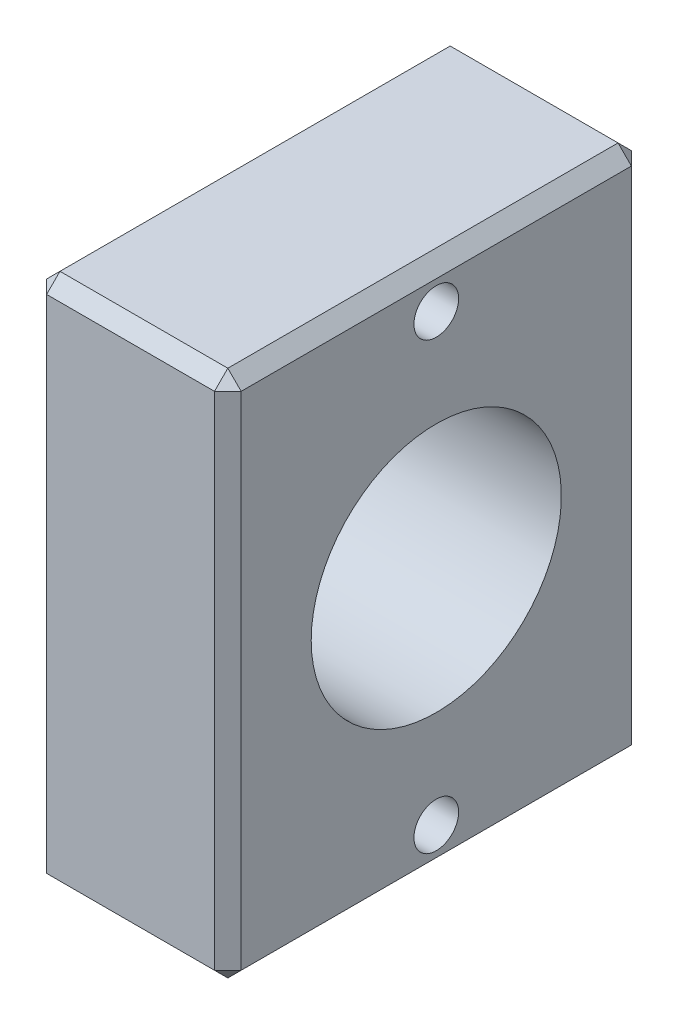
ISO-10303-21;
HEADER;
FILE_DESCRIPTION(('STEP AP214'),'2;1');
FILE_NAME('part.step','',(''),(''),'','','');
FILE_SCHEMA(('AUTOMOTIVE_DESIGN { 1 0 10303 214 1 1 1 1 }'));
ENDSEC;
DATA;
#1=APPLICATION_CONTEXT('core data for automotive mechanical design processes');
#2=APPLICATION_PROTOCOL_DEFINITION('international standard','automotive_design',2000,#1);
#3=PRODUCT_CONTEXT('',#1,'mechanical');
#4=PRODUCT('Part','Part','',(#3));
#5=PRODUCT_RELATED_PRODUCT_CATEGORY('part','',(#4));
#6=PRODUCT_DEFINITION_FORMATION('','',#4);
#7=PRODUCT_DEFINITION_CONTEXT('part definition',#1,'design');
#8=PRODUCT_DEFINITION('design','',#6,#7);
#9=PRODUCT_DEFINITION_SHAPE('','',#8);
#10=(LENGTH_UNIT() NAMED_UNIT(*) SI_UNIT(.MILLI.,.METRE.));
#11=(NAMED_UNIT(*) PLANE_ANGLE_UNIT() SI_UNIT($,.RADIAN.));
#12=(NAMED_UNIT(*) SI_UNIT($,.STERADIAN.) SOLID_ANGLE_UNIT());
#13=UNCERTAINTY_MEASURE_WITH_UNIT(LENGTH_MEASURE(1.E-05),#10,'distance_accuracy_value','');
#14=(GEOMETRIC_REPRESENTATION_CONTEXT(3) GLOBAL_UNCERTAINTY_ASSIGNED_CONTEXT((#13)) GLOBAL_UNIT_ASSIGNED_CONTEXT((#10,
#11,#12)) REPRESENTATION_CONTEXT('',''));
#15=CARTESIAN_POINT('',(0.,0.,0.));
#16=DIRECTION('',(0.,0.,1.));
#17=DIRECTION('',(1.,0.,0.));
#18=AXIS2_PLACEMENT_3D('',#15,#16,#17);
#19=CARTESIAN_POINT('',(-11.1125,30.1625,23.8125));
#20=DIRECTION('',(1.,0.,0.));
#21=DIRECTION('',(0.,0.,-1.));
#22=AXIS2_PLACEMENT_3D('',#19,#20,#21);
#23=PLANE('',#22);
#24=DIRECTION('',(0.,-1.,0.));
#25=VECTOR('',#24,1.);
#26=CARTESIAN_POINT('',(-11.1125,30.1625,-22.2885));
#27=LINE('',#26,#25);
#28=CARTESIAN_POINT('',(-11.1125,28.6385,-22.2885));
#29=VERTEX_POINT('',#28);
#30=CARTESIAN_POINT('',(-11.1125,-28.6385,-22.2885));
#31=VERTEX_POINT('',#30);
#32=EDGE_CURVE('E189',#29,#31,#27,.T.);
#33=ORIENTED_EDGE('',*,*,#32,.T.);
#34=DIRECTION('',(0.,0.,1.));
#35=VECTOR('',#34,1.);
#36=CARTESIAN_POINT('',(-11.1125,-28.6385,23.8125));
#37=LINE('',#36,#35);
#38=CARTESIAN_POINT('',(-11.1125,-28.6385,22.2885));
#39=VERTEX_POINT('',#38);
#40=EDGE_CURVE('E191',#31,#39,#37,.T.);
#41=ORIENTED_EDGE('',*,*,#40,.T.);
#42=DIRECTION('',(0.,1.,0.));
#43=VECTOR('',#42,1.);
#44=CARTESIAN_POINT('',(-11.1125,30.1625,22.2885));
#45=LINE('',#44,#43);
#46=CARTESIAN_POINT('',(-11.1125,28.6385,22.2885));
#47=VERTEX_POINT('',#46);
#48=EDGE_CURVE('E185',#39,#47,#45,.T.);
#49=ORIENTED_EDGE('',*,*,#48,.T.);
#50=DIRECTION('',(0.,0.,-1.));
#51=VECTOR('',#50,1.);
#52=CARTESIAN_POINT('',(-11.1125,28.6385,-23.8125));
#53=LINE('',#52,#51);
#54=EDGE_CURVE('E187',#47,#29,#53,.T.);
#55=ORIENTED_EDGE('',*,*,#54,.T.);
#56=EDGE_LOOP('',(#33,#41,#49,#55));
#57=FACE_BOUND('',#56,.T.);
#58=CARTESIAN_POINT('',(-11.1125,-25.4,0.));
#59=DIRECTION('',(-1.,0.,0.));
#60=DIRECTION('',(0.,0.,1.));
#61=AXIS2_PLACEMENT_3D('',#58,#59,#60);
#62=CIRCLE('',#61,2.5527);
#63=CARTESIAN_POINT('',(-11.1125,-25.4,2.5527));
#64=VERTEX_POINT('',#63);
#65=EDGE_CURVE('E274',#64,#64,#62,.T.);
#66=ORIENTED_EDGE('',*,*,#65,.F.);
#67=EDGE_LOOP('',(#66));
#68=FACE_BOUND('',#67,.T.);
#69=CARTESIAN_POINT('',(-11.1125,25.4,0.));
#70=DIRECTION('',(-1.,0.,0.));
#71=DIRECTION('',(0.,0.,1.));
#72=AXIS2_PLACEMENT_3D('',#69,#70,#71);
#73=CIRCLE('',#72,2.5527);
#74=CARTESIAN_POINT('',(-11.1125,25.4,2.5527));
#75=VERTEX_POINT('',#74);
#76=EDGE_CURVE('E283',#75,#75,#73,.T.);
#77=ORIENTED_EDGE('',*,*,#76,.F.);
#78=EDGE_LOOP('',(#77));
#79=FACE_BOUND('',#78,.T.);
#80=CARTESIAN_POINT('',(-11.1125,0.,0.));
#81=DIRECTION('',(-1.,0.,0.));
#82=DIRECTION('',(0.,0.,1.));
#83=AXIS2_PLACEMENT_3D('',#80,#81,#82);
#84=CIRCLE('',#83,14.2875);
#85=CARTESIAN_POINT('',(-11.1125,0.,14.2875));
#86=VERTEX_POINT('',#85);
#87=EDGE_CURVE('E169',#86,#86,#84,.T.);
#88=ORIENTED_EDGE('',*,*,#87,.F.);
#89=EDGE_LOOP('',(#88));
#90=FACE_BOUND('',#89,.T.);
#91=ADVANCED_FACE('F41',(#57,#68,#79,#90),#23,.F.);
#92=CARTESIAN_POINT('',(11.1125,30.1625,23.8125));
#93=DIRECTION('',(0.,0.,-1.));
#94=DIRECTION('',(-1.,0.,0.));
#95=AXIS2_PLACEMENT_3D('',#92,#93,#94);
#96=PLANE('',#95);
#97=DIRECTION('',(-1.,0.,0.));
#98=VECTOR('',#97,1.);
#99=CARTESIAN_POINT('',(-11.1125,28.6385,23.8125));
#100=LINE('',#99,#98);
#101=CARTESIAN_POINT('',(9.5885,28.6385,23.8125));
#102=VERTEX_POINT('',#101);
#103=CARTESIAN_POINT('',(-9.58850000000001,28.6385,23.8125));
#104=VERTEX_POINT('',#103);
#105=EDGE_CURVE('E51',#102,#104,#100,.T.);
#106=ORIENTED_EDGE('',*,*,#105,.T.);
#107=DIRECTION('',(0.,-1.,0.));
#108=VECTOR('',#107,1.);
#109=CARTESIAN_POINT('',(-9.58850000000001,30.1625,23.8125));
#110=LINE('',#109,#108);
#111=CARTESIAN_POINT('',(-9.58850000000001,-28.6385,23.8125));
#112=VERTEX_POINT('',#111);
#113=EDGE_CURVE('E11',#104,#112,#110,.T.);
#114=ORIENTED_EDGE('',*,*,#113,.T.);
#115=DIRECTION('',(1.,0.,0.));
#116=VECTOR('',#115,1.);
#117=CARTESIAN_POINT('',(11.1125,-28.6385,23.8125));
#118=LINE('',#117,#116);
#119=CARTESIAN_POINT('',(9.5885,-28.6385,23.8125));
#120=VERTEX_POINT('',#119);
#121=EDGE_CURVE('E211',#112,#120,#118,.T.);
#122=ORIENTED_EDGE('',*,*,#121,.T.);
#123=DIRECTION('',(0.,1.,0.));
#124=VECTOR('',#123,1.);
#125=CARTESIAN_POINT('',(9.5885,30.1625,23.8125));
#126=LINE('',#125,#124);
#127=EDGE_CURVE('E62',#120,#102,#126,.T.);
#128=ORIENTED_EDGE('',*,*,#127,.T.);
#129=EDGE_LOOP('',(#106,#114,#122,#128));
#130=FACE_BOUND('',#129,.T.);
#131=ADVANCED_FACE('F293',(#130),#96,.F.);
#132=CARTESIAN_POINT('',(11.1125,30.1625,23.8125));
#133=DIRECTION('',(-1.,0.,0.));
#134=DIRECTION('',(0.,0.,1.));
#135=AXIS2_PLACEMENT_3D('',#132,#133,#134);
#136=PLANE('',#135);
#137=DIRECTION('',(0.,-1.,0.));
#138=VECTOR('',#137,1.);
#139=CARTESIAN_POINT('',(11.1125,30.1625,22.2885));
#140=LINE('',#139,#138);
#141=CARTESIAN_POINT('',(11.1125,28.6385,22.2885));
#142=VERTEX_POINT('',#141);
#143=CARTESIAN_POINT('',(11.1125,-28.6385,22.2885));
#144=VERTEX_POINT('',#143);
#145=EDGE_CURVE('E135',#142,#144,#140,.T.);
#146=ORIENTED_EDGE('',*,*,#145,.T.);
#147=DIRECTION('',(0.,0.,-1.));
#148=VECTOR('',#147,1.);
#149=CARTESIAN_POINT('',(11.1125,-28.6385,23.8125));
#150=LINE('',#149,#148);
#151=CARTESIAN_POINT('',(11.1125,-28.6385,-22.2885));
#152=VERTEX_POINT('',#151);
#153=EDGE_CURVE('E174',#144,#152,#150,.T.);
#154=ORIENTED_EDGE('',*,*,#153,.T.);
#155=DIRECTION('',(0.,1.,0.));
#156=VECTOR('',#155,1.);
#157=CARTESIAN_POINT('',(11.1125,30.1625,-22.2885));
#158=LINE('',#157,#156);
#159=CARTESIAN_POINT('',(11.1125,28.6385,-22.2885));
#160=VERTEX_POINT('',#159);
#161=EDGE_CURVE('E138',#152,#160,#158,.T.);
#162=ORIENTED_EDGE('',*,*,#161,.T.);
#163=DIRECTION('',(0.,0.,1.));
#164=VECTOR('',#163,1.);
#165=CARTESIAN_POINT('',(11.1125,28.6385,23.8125));
#166=LINE('',#165,#164);
#167=EDGE_CURVE('E129',#160,#142,#166,.T.);
#168=ORIENTED_EDGE('',*,*,#167,.T.);
#169=EDGE_LOOP('',(#146,#154,#162,#168));
#170=FACE_BOUND('',#169,.T.);
#171=CARTESIAN_POINT('',(11.1125,-25.4,0.));
#172=DIRECTION('',(-1.,0.,0.));
#173=DIRECTION('',(0.,0.,1.));
#174=AXIS2_PLACEMENT_3D('',#171,#172,#173);
#175=CIRCLE('',#174,2.5527);
#176=CARTESIAN_POINT('',(11.1125,-25.4,2.5527));
#177=VERTEX_POINT('',#176);
#178=EDGE_CURVE('E268',#177,#177,#175,.T.);
#179=ORIENTED_EDGE('',*,*,#178,.T.);
#180=EDGE_LOOP('',(#179));
#181=FACE_BOUND('',#180,.T.);
#182=CARTESIAN_POINT('',(11.1125,25.4,0.));
#183=DIRECTION('',(-1.,0.,0.));
#184=DIRECTION('',(0.,0.,1.));
#185=AXIS2_PLACEMENT_3D('',#182,#183,#184);
#186=CIRCLE('',#185,2.5527);
#187=CARTESIAN_POINT('',(11.1125,25.4,2.5527));
#188=VERTEX_POINT('',#187);
#189=EDGE_CURVE('E278',#188,#188,#186,.T.);
#190=ORIENTED_EDGE('',*,*,#189,.T.);
#191=EDGE_LOOP('',(#190));
#192=FACE_BOUND('',#191,.T.);
#193=CARTESIAN_POINT('',(11.1125,0.,0.));
#194=DIRECTION('',(-1.,0.,0.));
#195=DIRECTION('',(0.,0.,1.));
#196=AXIS2_PLACEMENT_3D('',#193,#194,#195);
#197=CIRCLE('',#196,14.2875);
#198=CARTESIAN_POINT('',(11.1125,0.,14.2875));
#199=VERTEX_POINT('',#198);
#200=EDGE_CURVE('E166',#199,#199,#197,.T.);
#201=ORIENTED_EDGE('',*,*,#200,.T.);
#202=EDGE_LOOP('',(#201));
#203=FACE_BOUND('',#202,.T.);
#204=ADVANCED_FACE('F131',(#170,#181,#192,#203),#136,.F.);
#205=CARTESIAN_POINT('',(11.1125,30.1625,-23.8125));
#206=DIRECTION('',(0.,0.,1.));
#207=DIRECTION('',(1.,0.,0.));
#208=AXIS2_PLACEMENT_3D('',#205,#206,#207);
#209=PLANE('',#208);
#210=DIRECTION('',(1.,0.,0.));
#211=VECTOR('',#210,1.);
#212=CARTESIAN_POINT('',(11.1125,28.6385,-23.8125));
#213=LINE('',#212,#211);
#214=CARTESIAN_POINT('',(-9.5885,28.6385,-23.8125));
#215=VERTEX_POINT('',#214);
#216=CARTESIAN_POINT('',(9.5885,28.6385,-23.8125));
#217=VERTEX_POINT('',#216);
#218=EDGE_CURVE('E194',#215,#217,#213,.T.);
#219=ORIENTED_EDGE('',*,*,#218,.T.);
#220=DIRECTION('',(0.,-1.,0.));
#221=VECTOR('',#220,1.);
#222=CARTESIAN_POINT('',(9.5885,30.1625,-23.8125));
#223=LINE('',#222,#221);
#224=CARTESIAN_POINT('',(9.5885,-28.6385,-23.8125));
#225=VERTEX_POINT('',#224);
#226=EDGE_CURVE('E200',#217,#225,#223,.T.);
#227=ORIENTED_EDGE('',*,*,#226,.T.);
#228=DIRECTION('',(-1.,0.,0.));
#229=VECTOR('',#228,1.);
#230=CARTESIAN_POINT('',(11.1125,-28.6385,-23.8125));
#231=LINE('',#230,#229);
#232=CARTESIAN_POINT('',(-9.5885,-28.6385,-23.8125));
#233=VERTEX_POINT('',#232);
#234=EDGE_CURVE('E198',#225,#233,#231,.T.);
#235=ORIENTED_EDGE('',*,*,#234,.T.);
#236=DIRECTION('',(0.,1.,0.));
#237=VECTOR('',#236,1.);
#238=CARTESIAN_POINT('',(-9.5885,30.1625,-23.8125));
#239=LINE('',#238,#237);
#240=EDGE_CURVE('E196',#233,#215,#239,.T.);
#241=ORIENTED_EDGE('',*,*,#240,.T.);
#242=EDGE_LOOP('',(#219,#227,#235,#241));
#243=FACE_BOUND('',#242,.T.);
#244=ADVANCED_FACE('F465',(#243),#209,.F.);
#245=CARTESIAN_POINT('',(0.,30.1625,0.));
#246=DIRECTION('',(0.,1.,0.));
#247=DIRECTION('',(0.,0.,1.));
#248=AXIS2_PLACEMENT_3D('',#245,#246,#247);
#249=PLANE('',#248);
#250=DIRECTION('',(0.,0.,-1.));
#251=VECTOR('',#250,1.);
#252=CARTESIAN_POINT('',(9.5885,30.1625,-23.8125));
#253=LINE('',#252,#251);
#254=CARTESIAN_POINT('',(9.5885,30.1625,22.2885));
#255=VERTEX_POINT('',#254);
#256=CARTESIAN_POINT('',(9.5885,30.1625,-22.2885));
#257=VERTEX_POINT('',#256);
#258=EDGE_CURVE('E148',#255,#257,#253,.T.);
#259=ORIENTED_EDGE('',*,*,#258,.T.);
#260=DIRECTION('',(-1.,0.,0.));
#261=VECTOR('',#260,1.);
#262=CARTESIAN_POINT('',(-11.1125,30.1625,-22.2885));
#263=LINE('',#262,#261);
#264=CARTESIAN_POINT('',(-9.58850000000001,30.1625,-22.2885));
#265=VERTEX_POINT('',#264);
#266=EDGE_CURVE('E208',#257,#265,#263,.T.);
#267=ORIENTED_EDGE('',*,*,#266,.T.);
#268=DIRECTION('',(0.,0.,1.));
#269=VECTOR('',#268,1.);
#270=CARTESIAN_POINT('',(-9.58850000000001,30.1625,23.8125));
#271=LINE('',#270,#269);
#272=CARTESIAN_POINT('',(-9.58850000000001,30.1625,22.2885));
#273=VERTEX_POINT('',#272);
#274=EDGE_CURVE('E205',#265,#273,#271,.T.);
#275=ORIENTED_EDGE('',*,*,#274,.T.);
#276=DIRECTION('',(1.,0.,0.));
#277=VECTOR('',#276,1.);
#278=CARTESIAN_POINT('',(11.1125,30.1625,22.2885));
#279=LINE('',#278,#277);
#280=EDGE_CURVE('E203',#273,#255,#279,.T.);
#281=ORIENTED_EDGE('',*,*,#280,.T.);
#282=EDGE_LOOP('',(#259,#267,#275,#281));
#283=FACE_BOUND('',#282,.T.);
#284=ADVANCED_FACE('F435',(#283),#249,.T.);
#285=CARTESIAN_POINT('',(0.,-30.1625,0.));
#286=DIRECTION('',(0.,1.,0.));
#287=DIRECTION('',(0.,0.,1.));
#288=AXIS2_PLACEMENT_3D('',#285,#286,#287);
#289=PLANE('',#288);
#290=DIRECTION('',(0.,0.,-1.));
#291=VECTOR('',#290,1.);
#292=CARTESIAN_POINT('',(-9.58850000000001,-30.1625,0.));
#293=LINE('',#292,#291);
#294=CARTESIAN_POINT('',(-9.58850000000001,-30.1625,22.2885));
#295=VERTEX_POINT('',#294);
#296=CARTESIAN_POINT('',(-9.58850000000001,-30.1625,-22.2885));
#297=VERTEX_POINT('',#296);
#298=EDGE_CURVE('E178',#295,#297,#293,.T.);
#299=ORIENTED_EDGE('',*,*,#298,.T.);
#300=DIRECTION('',(1.,0.,0.));
#301=VECTOR('',#300,1.);
#302=CARTESIAN_POINT('',(0.,-30.1625,-22.2885));
#303=LINE('',#302,#301);
#304=CARTESIAN_POINT('',(9.5885,-30.1625,-22.2885));
#305=VERTEX_POINT('',#304);
#306=EDGE_CURVE('E183',#297,#305,#303,.T.);
#307=ORIENTED_EDGE('',*,*,#306,.T.);
#308=DIRECTION('',(0.,0.,1.));
#309=VECTOR('',#308,1.);
#310=CARTESIAN_POINT('',(9.5885,-30.1625,0.));
#311=LINE('',#310,#309);
#312=CARTESIAN_POINT('',(9.5885,-30.1625,22.2885));
#313=VERTEX_POINT('',#312);
#314=EDGE_CURVE('E180',#305,#313,#311,.T.);
#315=ORIENTED_EDGE('',*,*,#314,.T.);
#316=DIRECTION('',(-1.,0.,0.));
#317=VECTOR('',#316,1.);
#318=CARTESIAN_POINT('',(0.,-30.1625,22.2885));
#319=LINE('',#318,#317);
#320=EDGE_CURVE('E176',#313,#295,#319,.T.);
#321=ORIENTED_EDGE('',*,*,#320,.T.);
#322=EDGE_LOOP('',(#299,#307,#315,#321));
#323=FACE_BOUND('',#322,.T.);
#324=ADVANCED_FACE('F463',(#323),#289,.F.);
#325=CARTESIAN_POINT('',(11.1125,0.,0.));
#326=DIRECTION('',(-1.,0.,0.));
#327=DIRECTION('',(0.,0.,1.));
#328=AXIS2_PLACEMENT_3D('',#325,#326,#327);
#329=CYLINDRICAL_SURFACE('',#328,14.2875);
#330=ORIENTED_EDGE('',*,*,#200,.F.);
#331=EDGE_LOOP('',(#330));
#332=FACE_BOUND('',#331,.T.);
#333=ORIENTED_EDGE('',*,*,#87,.T.);
#334=EDGE_LOOP('',(#333));
#335=FACE_BOUND('',#334,.T.);
#336=ADVANCED_FACE('F290',(#332,#335),#329,.F.);
#337=CARTESIAN_POINT('',(11.1125,25.4,0.));
#338=DIRECTION('',(-1.,0.,0.));
#339=DIRECTION('',(0.,0.,1.));
#340=AXIS2_PLACEMENT_3D('',#337,#338,#339);
#341=CYLINDRICAL_SURFACE('',#340,2.5527);
#342=ORIENTED_EDGE('',*,*,#189,.F.);
#343=EDGE_LOOP('',(#342));
#344=FACE_BOUND('',#343,.T.);
#345=ORIENTED_EDGE('',*,*,#76,.T.);
#346=EDGE_LOOP('',(#345));
#347=FACE_BOUND('',#346,.T.);
#348=ADVANCED_FACE('F478',(#344,#347),#341,.F.);
#349=CARTESIAN_POINT('',(11.1125,-25.4,0.));
#350=DIRECTION('',(-1.,0.,0.));
#351=DIRECTION('',(0.,0.,1.));
#352=AXIS2_PLACEMENT_3D('',#349,#350,#351);
#353=CYLINDRICAL_SURFACE('',#352,2.5527);
#354=ORIENTED_EDGE('',*,*,#178,.F.);
#355=EDGE_LOOP('',(#354));
#356=FACE_BOUND('',#355,.T.);
#357=ORIENTED_EDGE('',*,*,#65,.T.);
#358=EDGE_LOOP('',(#357));
#359=FACE_BOUND('',#358,.T.);
#360=ADVANCED_FACE('F430',(#356,#359),#353,.F.);
#361=CARTESIAN_POINT('',(-9.58850000000001,30.1625,0.));
#362=DIRECTION('',(-0.707106781186549,0.707106781186546,0.));
#363=DIRECTION('',(0.,0.,-1.));
#364=AXIS2_PLACEMENT_3D('',#361,#362,#363);
#365=PLANE('',#364);
#366=DIRECTION('',(-0.707106781186546,-0.707106781186549,0.));
#367=VECTOR('',#366,1.);
#368=CARTESIAN_POINT('',(-9.58850000000001,30.1625,22.2885));
#369=LINE('',#368,#367);
#370=EDGE_CURVE('E46',#273,#47,#369,.T.);
#371=ORIENTED_EDGE('',*,*,#370,.F.);
#372=ORIENTED_EDGE('',*,*,#274,.F.);
#373=DIRECTION('',(0.707106781186546,0.707106781186549,0.));
#374=VECTOR('',#373,1.);
#375=CARTESIAN_POINT('',(-10.3505,29.4005,-22.2885));
#376=LINE('',#375,#374);
#377=EDGE_CURVE('E260',#29,#265,#376,.T.);
#378=ORIENTED_EDGE('',*,*,#377,.F.);
#379=ORIENTED_EDGE('',*,*,#54,.F.);
#380=EDGE_LOOP('',(#371,#372,#378,#379));
#381=FACE_BOUND('',#380,.T.);
#382=ADVANCED_FACE('F44',(#381),#365,.T.);
#383=CARTESIAN_POINT('',(-9.58850000000001,30.1625,22.2885));
#384=DIRECTION('',(-0.577350269189628,0.577350269189625,0.577350269189624));
#385=DIRECTION('',(-0.707106781186546,-0.707106781186549,0.));
#386=AXIS2_PLACEMENT_3D('',#383,#384,#385);
#387=PLANE('',#386);
#388=DIRECTION('',(0.,0.707106781186546,-0.707106781186549));
#389=VECTOR('',#388,1.);
#390=CARTESIAN_POINT('',(-9.58850000000001,30.1625,22.2885));
#391=LINE('',#390,#389);
#392=EDGE_CURVE('E256',#273,#104,#391,.F.);
#393=ORIENTED_EDGE('',*,*,#392,.F.);
#394=ORIENTED_EDGE('',*,*,#370,.T.);
#395=DIRECTION('',(-0.707106781186547,0.,-0.707106781186548));
#396=VECTOR('',#395,1.);
#397=CARTESIAN_POINT('',(-10.3505,28.6385,23.0505));
#398=LINE('',#397,#396);
#399=EDGE_CURVE('E258',#104,#47,#398,.T.);
#400=ORIENTED_EDGE('',*,*,#399,.F.);
#401=EDGE_LOOP('',(#393,#394,#400));
#402=FACE_BOUND('',#401,.T.);
#403=ADVANCED_FACE('F423',(#402),#387,.T.);
#404=CARTESIAN_POINT('',(-9.5885,28.6385,-23.8125));
#405=DIRECTION('',(-0.577350269189627,0.577350269189622,-0.577350269189628));
#406=DIRECTION('',(-0.707106781186548,0.,0.707106781186547));
#407=AXIS2_PLACEMENT_3D('',#404,#405,#406);
#408=PLANE('',#407);
#409=DIRECTION('',(0.707106781186548,0.,-0.707106781186547));
#410=VECTOR('',#409,1.);
#411=CARTESIAN_POINT('',(-9.5885,28.6385,-23.8125));
#412=LINE('',#411,#410);
#413=EDGE_CURVE('E251',#29,#215,#412,.T.);
#414=ORIENTED_EDGE('',*,*,#413,.F.);
#415=ORIENTED_EDGE('',*,*,#377,.T.);
#416=DIRECTION('',(0.,-0.707106781186549,-0.707106781186545));
#417=VECTOR('',#416,1.);
#418=CARTESIAN_POINT('',(-9.5885,28.6385,-23.8125));
#419=LINE('',#418,#417);
#420=EDGE_CURVE('E254',#215,#265,#419,.F.);
#421=ORIENTED_EDGE('',*,*,#420,.F.);
#422=EDGE_LOOP('',(#414,#415,#421));
#423=FACE_BOUND('',#422,.T.);
#424=ADVANCED_FACE('F417',(#423),#408,.T.);
#425=CARTESIAN_POINT('',(-9.58850000000001,30.1625,23.8125));
#426=DIRECTION('',(0.707106781186548,0.,-0.707106781186547));
#427=DIRECTION('',(0.,-1.,0.));
#428=AXIS2_PLACEMENT_3D('',#425,#426,#427);
#429=PLANE('',#428);
#430=ORIENTED_EDGE('',*,*,#399,.T.);
#431=ORIENTED_EDGE('',*,*,#48,.F.);
#432=DIRECTION('',(0.707106781186547,0.,0.707106781186548));
#433=VECTOR('',#432,1.);
#434=CARTESIAN_POINT('',(-11.1125,-28.6385,22.2885));
#435=LINE('',#434,#433);
#436=EDGE_CURVE('E246',#112,#39,#435,.F.);
#437=ORIENTED_EDGE('',*,*,#436,.F.);
#438=ORIENTED_EDGE('',*,*,#113,.F.);
#439=EDGE_LOOP('',(#430,#431,#437,#438));
#440=FACE_BOUND('',#439,.T.);
#441=ADVANCED_FACE('F410',(#440),#429,.F.);
#442=CARTESIAN_POINT('',(0.,30.1625,22.2885));
#443=DIRECTION('',(0.,0.707106781186549,0.707106781186546));
#444=DIRECTION('',(-1.,0.,0.));
#445=AXIS2_PLACEMENT_3D('',#442,#443,#444);
#446=PLANE('',#445);
#447=ORIENTED_EDGE('',*,*,#392,.T.);
#448=ORIENTED_EDGE('',*,*,#105,.F.);
#449=DIRECTION('',(0.,-0.707106781186546,0.707106781186549));
#450=VECTOR('',#449,1.);
#451=CARTESIAN_POINT('',(9.5885,29.4005,23.0505));
#452=LINE('',#451,#450);
#453=EDGE_CURVE('E152',#255,#102,#452,.T.);
#454=ORIENTED_EDGE('',*,*,#453,.F.);
#455=ORIENTED_EDGE('',*,*,#280,.F.);
#456=EDGE_LOOP('',(#447,#448,#454,#455));
#457=FACE_BOUND('',#456,.T.);
#458=ADVANCED_FACE('F404',(#457),#446,.T.);
#459=CARTESIAN_POINT('',(9.5885,30.1625,0.));
#460=DIRECTION('',(0.707106781186549,0.707106781186546,0.));
#461=DIRECTION('',(0.,0.,1.));
#462=AXIS2_PLACEMENT_3D('',#459,#460,#461);
#463=PLANE('',#462);
#464=DIRECTION('',(0.707106781186546,-0.707106781186549,0.));
#465=VECTOR('',#464,1.);
#466=CARTESIAN_POINT('',(11.1125,28.6385,-22.2885));
#467=LINE('',#466,#465);
#468=EDGE_CURVE('E153',#257,#160,#467,.T.);
#469=ORIENTED_EDGE('',*,*,#468,.F.);
#470=ORIENTED_EDGE('',*,*,#258,.F.);
#471=DIRECTION('',(-0.707106781186546,0.707106781186549,0.));
#472=VECTOR('',#471,1.);
#473=CARTESIAN_POINT('',(11.1125,28.6385,22.2885));
#474=LINE('',#473,#472);
#475=EDGE_CURVE('E145',#142,#255,#474,.T.);
#476=ORIENTED_EDGE('',*,*,#475,.F.);
#477=ORIENTED_EDGE('',*,*,#167,.F.);
#478=EDGE_LOOP('',(#469,#470,#476,#477));
#479=FACE_BOUND('',#478,.T.);
#480=ADVANCED_FACE('F147',(#479),#463,.T.);
#481=CARTESIAN_POINT('',(0.,30.1625,-22.2885));
#482=DIRECTION('',(0.,0.707106781186546,-0.70710678118655));
#483=DIRECTION('',(1.,0.,0.));
#484=AXIS2_PLACEMENT_3D('',#481,#482,#483);
#485=PLANE('',#484);
#486=ORIENTED_EDGE('',*,*,#420,.T.);
#487=ORIENTED_EDGE('',*,*,#266,.F.);
#488=DIRECTION('',(0.,0.707106781186549,0.707106781186546));
#489=VECTOR('',#488,1.);
#490=CARTESIAN_POINT('',(9.5885,29.4005,-23.0505));
#491=LINE('',#490,#489);
#492=EDGE_CURVE('E241',#217,#257,#491,.T.);
#493=ORIENTED_EDGE('',*,*,#492,.F.);
#494=ORIENTED_EDGE('',*,*,#218,.F.);
#495=EDGE_LOOP('',(#486,#487,#493,#494));
#496=FACE_BOUND('',#495,.T.);
#497=ADVANCED_FACE('F391',(#496),#485,.T.);
#498=CARTESIAN_POINT('',(-11.1125,30.1625,-22.2885));
#499=DIRECTION('',(0.707106781186547,0.,0.707106781186548));
#500=DIRECTION('',(0.,-1.,0.));
#501=AXIS2_PLACEMENT_3D('',#498,#499,#500);
#502=PLANE('',#501);
#503=ORIENTED_EDGE('',*,*,#413,.T.);
#504=ORIENTED_EDGE('',*,*,#240,.F.);
#505=DIRECTION('',(-0.707106781186548,0.,0.707106781186547));
#506=VECTOR('',#505,1.);
#507=CARTESIAN_POINT('',(-10.3505,-28.6385,-23.0505));
#508=LINE('',#507,#506);
#509=EDGE_CURVE('E238',#31,#233,#508,.F.);
#510=ORIENTED_EDGE('',*,*,#509,.F.);
#511=ORIENTED_EDGE('',*,*,#32,.F.);
#512=EDGE_LOOP('',(#503,#504,#510,#511));
#513=FACE_BOUND('',#512,.T.);
#514=ADVANCED_FACE('F384',(#513),#502,.F.);
#515=CARTESIAN_POINT('',(-11.1125,-28.6385,23.8125));
#516=DIRECTION('',(0.707106781186546,0.707106781186549,0.));
#517=DIRECTION('',(0.,0.,1.));
#518=AXIS2_PLACEMENT_3D('',#515,#516,#517);
#519=PLANE('',#518);
#520=DIRECTION('',(-0.707106781186549,0.707106781186546,0.));
#521=VECTOR('',#520,1.);
#522=CARTESIAN_POINT('',(-11.1125,-28.6385,22.2885));
#523=LINE('',#522,#521);
#524=EDGE_CURVE('E248',#39,#295,#523,.F.);
#525=ORIENTED_EDGE('',*,*,#524,.F.);
#526=ORIENTED_EDGE('',*,*,#40,.F.);
#527=DIRECTION('',(0.707106781186549,-0.707106781186546,0.));
#528=VECTOR('',#527,1.);
#529=CARTESIAN_POINT('',(-9.58850000000001,-30.1625,-22.2885));
#530=LINE('',#529,#528);
#531=EDGE_CURVE('E235',#297,#31,#530,.F.);
#532=ORIENTED_EDGE('',*,*,#531,.F.);
#533=ORIENTED_EDGE('',*,*,#298,.F.);
#534=EDGE_LOOP('',(#525,#526,#532,#533));
#535=FACE_BOUND('',#534,.T.);
#536=ADVANCED_FACE('F377',(#535),#519,.F.);
#537=CARTESIAN_POINT('',(-11.1125,-28.6385,22.2885));
#538=DIRECTION('',(-0.577350269189625,-0.577350269189628,0.577350269189624));
#539=DIRECTION('',(0.707106781186549,-0.707106781186546,0.));
#540=AXIS2_PLACEMENT_3D('',#537,#538,#539);
#541=PLANE('',#540);
#542=ORIENTED_EDGE('',*,*,#436,.T.);
#543=ORIENTED_EDGE('',*,*,#524,.T.);
#544=DIRECTION('',(0.,-0.707106781186546,-0.707106781186549));
#545=VECTOR('',#544,1.);
#546=CARTESIAN_POINT('',(-9.58850000000001,-29.4005,23.0505));
#547=LINE('',#546,#545);
#548=EDGE_CURVE('E159',#112,#295,#547,.T.);
#549=ORIENTED_EDGE('',*,*,#548,.F.);
#550=EDGE_LOOP('',(#542,#543,#549));
#551=FACE_BOUND('',#550,.T.);
#552=ADVANCED_FACE('F371',(#551),#541,.T.);
#553=CARTESIAN_POINT('',(11.1125,28.6385,22.2885));
#554=DIRECTION('',(0.577350269189628,0.577350269189626,0.577350269189623));
#555=DIRECTION('',(-0.707106781186546,0.707106781186549,0.));
#556=AXIS2_PLACEMENT_3D('',#553,#554,#555);
#557=PLANE('',#556);
#558=ORIENTED_EDGE('',*,*,#475,.T.);
#559=ORIENTED_EDGE('',*,*,#453,.T.);
#560=DIRECTION('',(-0.707106781186546,0.,0.707106781186549));
#561=VECTOR('',#560,1.);
#562=CARTESIAN_POINT('',(11.1125,28.6385,22.2885));
#563=LINE('',#562,#561);
#564=EDGE_CURVE('E156',#142,#102,#563,.T.);
#565=ORIENTED_EDGE('',*,*,#564,.F.);
#566=EDGE_LOOP('',(#558,#559,#565));
#567=FACE_BOUND('',#566,.T.);
#568=ADVANCED_FACE('F157',(#567),#557,.T.);
#569=CARTESIAN_POINT('',(11.1125,28.6385,-22.2885));
#570=DIRECTION('',(0.577350269189631,0.577350269189622,-0.577350269189624));
#571=DIRECTION('',(-0.707106781186543,0.,-0.707106781186552));
#572=AXIS2_PLACEMENT_3D('',#569,#570,#571);
#573=PLANE('',#572);
#574=ORIENTED_EDGE('',*,*,#492,.T.);
#575=ORIENTED_EDGE('',*,*,#468,.T.);
#576=DIRECTION('',(0.707106781186543,0.,0.707106781186552));
#577=VECTOR('',#576,1.);
#578=CARTESIAN_POINT('',(11.1125,28.6385,-22.2885));
#579=LINE('',#578,#577);
#580=EDGE_CURVE('E160',#217,#160,#579,.T.);
#581=ORIENTED_EDGE('',*,*,#580,.F.);
#582=EDGE_LOOP('',(#574,#575,#581));
#583=FACE_BOUND('',#582,.T.);
#584=ADVANCED_FACE('F358',(#583),#573,.T.);
#585=CARTESIAN_POINT('',(-9.58850000000001,-30.1625,-22.2885));
#586=DIRECTION('',(-0.577350269189625,-0.577350269189626,-0.577350269189626));
#587=DIRECTION('',(0.,0.707106781186548,-0.707106781186548));
#588=AXIS2_PLACEMENT_3D('',#585,#586,#587);
#589=PLANE('',#588);
#590=ORIENTED_EDGE('',*,*,#531,.T.);
#591=ORIENTED_EDGE('',*,*,#509,.T.);
#592=DIRECTION('',(0.,0.707106781186546,-0.707106781186549));
#593=VECTOR('',#592,1.);
#594=CARTESIAN_POINT('',(-9.58850000000001,-30.1625,-22.2885));
#595=LINE('',#594,#593);
#596=EDGE_CURVE('E228',#297,#233,#595,.T.);
#597=ORIENTED_EDGE('',*,*,#596,.F.);
#598=EDGE_LOOP('',(#590,#591,#597));
#599=FACE_BOUND('',#598,.T.);
#600=ADVANCED_FACE('F351',(#599),#589,.T.);
#601=CARTESIAN_POINT('',(11.1125,-28.6385,23.8125));
#602=DIRECTION('',(0.,0.707106781186549,-0.707106781186546));
#603=DIRECTION('',(1.,0.,0.));
#604=AXIS2_PLACEMENT_3D('',#601,#602,#603);
#605=PLANE('',#604);
#606=ORIENTED_EDGE('',*,*,#548,.T.);
#607=ORIENTED_EDGE('',*,*,#320,.F.);
#608=DIRECTION('',(0.,0.707106781186546,0.707106781186549));
#609=VECTOR('',#608,1.);
#610=CARTESIAN_POINT('',(9.5885,-30.1625,22.2885));
#611=LINE('',#610,#609);
#612=EDGE_CURVE('E225',#120,#313,#611,.F.);
#613=ORIENTED_EDGE('',*,*,#612,.F.);
#614=ORIENTED_EDGE('',*,*,#121,.F.);
#615=EDGE_LOOP('',(#606,#607,#613,#614));
#616=FACE_BOUND('',#615,.T.);
#617=ADVANCED_FACE('F345',(#616),#605,.F.);
#618=CARTESIAN_POINT('',(11.1125,30.1625,22.2885));
#619=DIRECTION('',(-0.707106781186549,0.,-0.707106781186546));
#620=DIRECTION('',(0.,-1.,0.));
#621=AXIS2_PLACEMENT_3D('',#618,#619,#620);
#622=PLANE('',#621);
#623=ORIENTED_EDGE('',*,*,#564,.T.);
#624=ORIENTED_EDGE('',*,*,#127,.F.);
#625=DIRECTION('',(0.707106781186546,0.,-0.707106781186549));
#626=VECTOR('',#625,1.);
#627=CARTESIAN_POINT('',(10.3505,-28.6385,23.0505));
#628=LINE('',#627,#626);
#629=EDGE_CURVE('E164',#144,#120,#628,.F.);
#630=ORIENTED_EDGE('',*,*,#629,.F.);
#631=ORIENTED_EDGE('',*,*,#145,.F.);
#632=EDGE_LOOP('',(#623,#624,#630,#631));
#633=FACE_BOUND('',#632,.T.);
#634=ADVANCED_FACE('F162',(#633),#622,.F.);
#635=CARTESIAN_POINT('',(9.5885,30.1625,-23.8125));
#636=DIRECTION('',(-0.707106781186552,0.,0.707106781186543));
#637=DIRECTION('',(0.,-1.,0.));
#638=AXIS2_PLACEMENT_3D('',#635,#636,#637);
#639=PLANE('',#638);
#640=ORIENTED_EDGE('',*,*,#580,.T.);
#641=ORIENTED_EDGE('',*,*,#161,.F.);
#642=DIRECTION('',(-0.707106781186543,0.,-0.707106781186552));
#643=VECTOR('',#642,1.);
#644=CARTESIAN_POINT('',(11.1125,-28.6385,-22.2885));
#645=LINE('',#644,#643);
#646=EDGE_CURVE('E221',#225,#152,#645,.F.);
#647=ORIENTED_EDGE('',*,*,#646,.F.);
#648=ORIENTED_EDGE('',*,*,#226,.F.);
#649=EDGE_LOOP('',(#640,#641,#647,#648));
#650=FACE_BOUND('',#649,.T.);
#651=ADVANCED_FACE('F332',(#650),#639,.F.);
#652=CARTESIAN_POINT('',(11.1125,-28.6385,-23.8125));
#653=DIRECTION('',(0.,0.707106781186549,0.707106781186546));
#654=DIRECTION('',(-1.,0.,0.));
#655=AXIS2_PLACEMENT_3D('',#652,#653,#654);
#656=PLANE('',#655);
#657=ORIENTED_EDGE('',*,*,#596,.T.);
#658=ORIENTED_EDGE('',*,*,#234,.F.);
#659=DIRECTION('',(0.,-0.707106781186546,0.707106781186549));
#660=VECTOR('',#659,1.);
#661=CARTESIAN_POINT('',(9.5885,-29.4005,-23.0505));
#662=LINE('',#661,#660);
#663=EDGE_CURVE('E219',#305,#225,#662,.F.);
#664=ORIENTED_EDGE('',*,*,#663,.F.);
#665=ORIENTED_EDGE('',*,*,#306,.F.);
#666=EDGE_LOOP('',(#657,#658,#664,#665));
#667=FACE_BOUND('',#666,.T.);
#668=ADVANCED_FACE('F325',(#667),#656,.F.);
#669=CARTESIAN_POINT('',(9.5885,-30.1625,22.2885));
#670=DIRECTION('',(0.577350269189626,-0.577350269189628,0.577350269189623));
#671=DIRECTION('',(0.707106781186549,0.707106781186546,0.));
#672=AXIS2_PLACEMENT_3D('',#669,#670,#671);
#673=PLANE('',#672);
#674=ORIENTED_EDGE('',*,*,#629,.T.);
#675=ORIENTED_EDGE('',*,*,#612,.T.);
#676=DIRECTION('',(-0.707106781186549,-0.707106781186546,0.));
#677=VECTOR('',#676,1.);
#678=CARTESIAN_POINT('',(9.5885,-30.1625,22.2885));
#679=LINE('',#678,#677);
#680=EDGE_CURVE('E217',#144,#313,#679,.T.);
#681=ORIENTED_EDGE('',*,*,#680,.F.);
#682=EDGE_LOOP('',(#674,#675,#681));
#683=FACE_BOUND('',#682,.T.);
#684=ADVANCED_FACE('F318',(#683),#673,.T.);
#685=CARTESIAN_POINT('',(11.1125,-28.6385,-22.2885));
#686=DIRECTION('',(0.577350269189629,-0.577350269189626,-0.577350269189622));
#687=DIRECTION('',(0.707106781186546,0.707106781186549,0.));
#688=AXIS2_PLACEMENT_3D('',#685,#686,#687);
#689=PLANE('',#688);
#690=ORIENTED_EDGE('',*,*,#663,.T.);
#691=ORIENTED_EDGE('',*,*,#646,.T.);
#692=DIRECTION('',(0.707106781186549,0.707106781186546,0.));
#693=VECTOR('',#692,1.);
#694=CARTESIAN_POINT('',(11.1125,-28.6385,-22.2885));
#695=LINE('',#694,#693);
#696=EDGE_CURVE('E215',#305,#152,#695,.T.);
#697=ORIENTED_EDGE('',*,*,#696,.F.);
#698=EDGE_LOOP('',(#690,#691,#697));
#699=FACE_BOUND('',#698,.T.);
#700=ADVANCED_FACE('F311',(#699),#689,.T.);
#701=CARTESIAN_POINT('',(11.1125,-28.6385,23.8125));
#702=DIRECTION('',(-0.707106781186546,0.707106781186549,0.));
#703=DIRECTION('',(0.,0.,-1.));
#704=AXIS2_PLACEMENT_3D('',#701,#702,#703);
#705=PLANE('',#704);
#706=ORIENTED_EDGE('',*,*,#680,.T.);
#707=ORIENTED_EDGE('',*,*,#314,.F.);
#708=ORIENTED_EDGE('',*,*,#696,.T.);
#709=ORIENTED_EDGE('',*,*,#153,.F.);
#710=EDGE_LOOP('',(#706,#707,#708,#709));
#711=FACE_BOUND('',#710,.T.);
#712=ADVANCED_FACE('F305',(#711),#705,.F.);
#713=CLOSED_SHELL('',(#91,#131,#204,#244,#284,#324,#336,#348,#360,#382,#403,#424,#441,#458,#480,
#497,#514,#536,#552,#568,#584,#600,#617,#634,#651,#668,#684,#700,#712));
#714=MANIFOLD_SOLID_BREP('B2',#713);
#715=ADVANCED_BREP_SHAPE_REPRESENTATION('',(#18,#714),#14);
#716=SHAPE_DEFINITION_REPRESENTATION(#9,#715);
ENDSEC;
END-ISO-10303-21;
